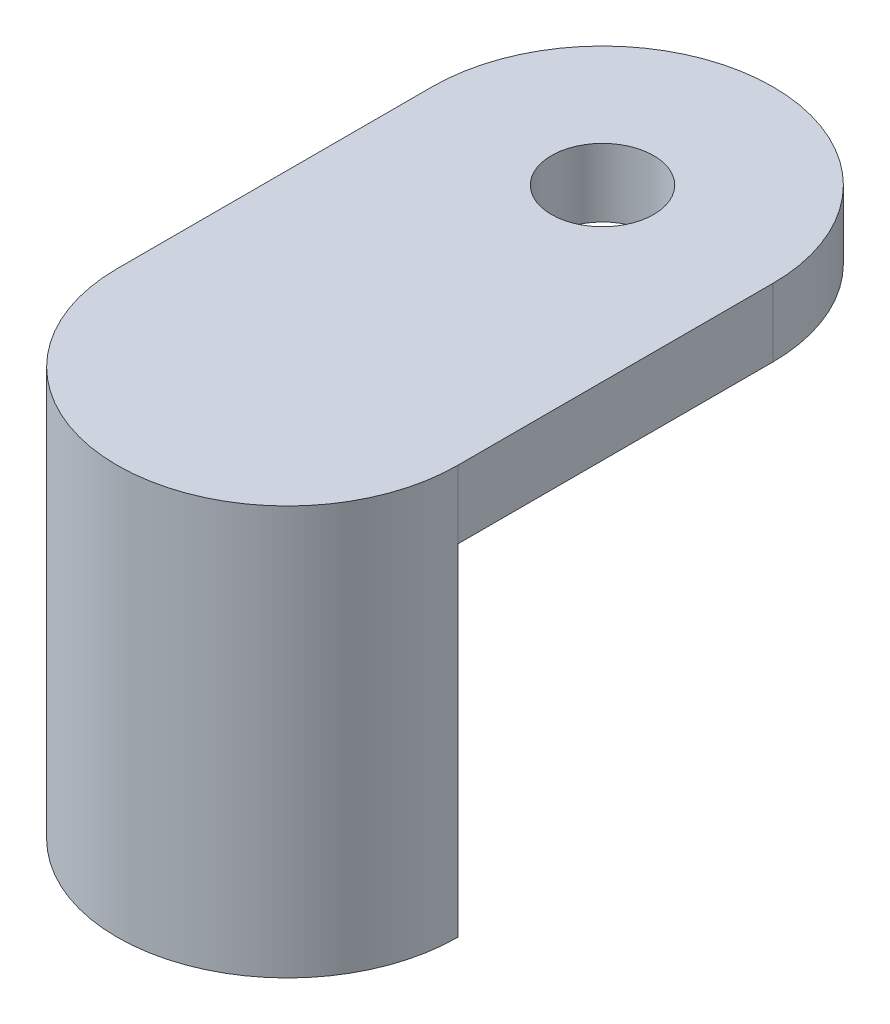
ISO-10303-21;
HEADER;
FILE_DESCRIPTION(('STEP AP214'),'2;1');
FILE_NAME('part.step','',(''),(''),'','','');
FILE_SCHEMA(('AUTOMOTIVE_DESIGN { 1 0 10303 214 1 1 1 1 }'));
ENDSEC;
DATA;
#1=APPLICATION_CONTEXT('core data for automotive mechanical design processes');
#2=APPLICATION_PROTOCOL_DEFINITION('international standard','automotive_design',2000,#1);
#3=PRODUCT_CONTEXT('',#1,'mechanical');
#4=PRODUCT('Part','Part','',(#3));
#5=PRODUCT_RELATED_PRODUCT_CATEGORY('part','',(#4));
#6=PRODUCT_DEFINITION_FORMATION('','',#4);
#7=PRODUCT_DEFINITION_CONTEXT('part definition',#1,'design');
#8=PRODUCT_DEFINITION('design','',#6,#7);
#9=PRODUCT_DEFINITION_SHAPE('','',#8);
#10=(LENGTH_UNIT() NAMED_UNIT(*) SI_UNIT(.MILLI.,.METRE.));
#11=(NAMED_UNIT(*) PLANE_ANGLE_UNIT() SI_UNIT($,.RADIAN.));
#12=(NAMED_UNIT(*) SI_UNIT($,.STERADIAN.) SOLID_ANGLE_UNIT());
#13=UNCERTAINTY_MEASURE_WITH_UNIT(LENGTH_MEASURE(1.E-05),#10,'distance_accuracy_value','');
#14=(GEOMETRIC_REPRESENTATION_CONTEXT(3) GLOBAL_UNCERTAINTY_ASSIGNED_CONTEXT((#13)) GLOBAL_UNIT_ASSIGNED_CONTEXT((#10,
#11,#12)) REPRESENTATION_CONTEXT('',''));
#15=CARTESIAN_POINT('',(0.,0.,0.));
#16=DIRECTION('',(0.,0.,1.));
#17=DIRECTION('',(1.,0.,0.));
#18=AXIS2_PLACEMENT_3D('',#15,#16,#17);
#19=CARTESIAN_POINT('',(0.,2.,0.));
#20=DIRECTION('',(0.,-1.,0.));
#21=DIRECTION('',(0.,0.,-1.));
#22=AXIS2_PLACEMENT_3D('',#19,#20,#21);
#23=CYLINDRICAL_SURFACE('',#22,5.);
#24=CARTESIAN_POINT('',(0.,0.,0.));
#25=DIRECTION('',(0.,1.,0.));
#26=DIRECTION('',(0.,0.,1.));
#27=AXIS2_PLACEMENT_3D('',#24,#25,#26);
#28=CIRCLE('',#27,5.);
#29=CARTESIAN_POINT('',(5.,0.,0.));
#30=VERTEX_POINT('',#29);
#31=CARTESIAN_POINT('',(-5.,0.,0.));
#32=VERTEX_POINT('',#31);
#33=EDGE_CURVE('E110',#30,#32,#28,.T.);
#34=ORIENTED_EDGE('',*,*,#33,.T.);
#35=DIRECTION('',(0.,-1.,0.));
#36=VECTOR('',#35,1.);
#37=CARTESIAN_POINT('',(-5.,2.,0.));
#38=LINE('',#37,#36);
#39=CARTESIAN_POINT('',(-5.,2.,0.));
#40=VERTEX_POINT('',#39);
#41=EDGE_CURVE('E43',#40,#32,#38,.T.);
#42=ORIENTED_EDGE('',*,*,#41,.F.);
#43=CARTESIAN_POINT('',(0.,2.,0.));
#44=DIRECTION('',(0.,1.,0.));
#45=DIRECTION('',(0.,0.,1.));
#46=AXIS2_PLACEMENT_3D('',#43,#44,#45);
#47=CIRCLE('',#46,5.);
#48=CARTESIAN_POINT('',(5.,2.,0.));
#49=VERTEX_POINT('',#48);
#50=EDGE_CURVE('E113',#49,#40,#47,.T.);
#51=ORIENTED_EDGE('',*,*,#50,.F.);
#52=DIRECTION('',(0.,-1.,0.));
#53=VECTOR('',#52,1.);
#54=CARTESIAN_POINT('',(5.,2.,0.));
#55=LINE('',#54,#53);
#56=EDGE_CURVE('E119',#49,#30,#55,.T.);
#57=ORIENTED_EDGE('',*,*,#56,.T.);
#58=EDGE_LOOP('',(#34,#42,#51,#57));
#59=FACE_BOUND('',#58,.T.);
#60=ADVANCED_FACE('F35',(#59),#23,.T.);
#61=CARTESIAN_POINT('',(-5.,2.,0.));
#62=DIRECTION('',(1.,0.,0.));
#63=DIRECTION('',(0.,0.,-1.));
#64=AXIS2_PLACEMENT_3D('',#61,#62,#63);
#65=PLANE('',#64);
#66=DIRECTION('',(0.,0.,1.));
#67=VECTOR('',#66,1.);
#68=CARTESIAN_POINT('',(-5.,0.,0.));
#69=LINE('',#68,#67);
#70=CARTESIAN_POINT('',(-5.,0.,9.25));
#71=VERTEX_POINT('',#70);
#72=EDGE_CURVE('E122',#32,#71,#69,.T.);
#73=ORIENTED_EDGE('',*,*,#72,.T.);
#74=DIRECTION('',(0.,-1.,0.));
#75=VECTOR('',#74,1.);
#76=CARTESIAN_POINT('',(-5.,2.,9.25));
#77=LINE('',#76,#75);
#78=CARTESIAN_POINT('',(-5.,2.,9.25));
#79=VERTEX_POINT('',#78);
#80=EDGE_CURVE('E129',#79,#71,#77,.T.);
#81=ORIENTED_EDGE('',*,*,#80,.F.);
#82=DIRECTION('',(0.,0.,1.));
#83=VECTOR('',#82,1.);
#84=CARTESIAN_POINT('',(-5.,2.,0.));
#85=LINE('',#84,#83);
#86=EDGE_CURVE('E80',#40,#79,#85,.T.);
#87=ORIENTED_EDGE('',*,*,#86,.F.);
#88=ORIENTED_EDGE('',*,*,#41,.T.);
#89=EDGE_LOOP('',(#73,#81,#87,#88));
#90=FACE_BOUND('',#89,.T.);
#91=ADVANCED_FACE('F131',(#90),#65,.F.);
#92=CARTESIAN_POINT('',(0.,2.,9.25));
#93=DIRECTION('',(0.,-1.,0.));
#94=DIRECTION('',(0.,0.,-1.));
#95=AXIS2_PLACEMENT_3D('',#92,#93,#94);
#96=CYLINDRICAL_SURFACE('',#95,5.);
#97=ORIENTED_EDGE('',*,*,#80,.T.);
#98=DIRECTION('',(0.,1.,0.));
#99=VECTOR('',#98,1.);
#100=CARTESIAN_POINT('',(-5.,-10.,9.25));
#101=LINE('',#100,#99);
#102=CARTESIAN_POINT('',(-5.,-10.,9.25));
#103=VERTEX_POINT('',#102);
#104=EDGE_CURVE('E66',#103,#71,#101,.T.);
#105=ORIENTED_EDGE('',*,*,#104,.F.);
#106=CARTESIAN_POINT('',(0.,-10.,9.25));
#107=DIRECTION('',(0.,1.,0.));
#108=DIRECTION('',(0.,0.,1.));
#109=AXIS2_PLACEMENT_3D('',#106,#107,#108);
#110=CIRCLE('',#109,5.);
#111=CARTESIAN_POINT('',(5.,-10.,9.25));
#112=VERTEX_POINT('',#111);
#113=EDGE_CURVE('E97',#103,#112,#110,.T.);
#114=ORIENTED_EDGE('',*,*,#113,.T.);
#115=DIRECTION('',(0.,1.,0.));
#116=VECTOR('',#115,1.);
#117=CARTESIAN_POINT('',(5.,-10.,9.25));
#118=LINE('',#117,#116);
#119=CARTESIAN_POINT('',(5.,0.,9.25));
#120=VERTEX_POINT('',#119);
#121=EDGE_CURVE('E88',#112,#120,#118,.T.);
#122=ORIENTED_EDGE('',*,*,#121,.T.);
#123=DIRECTION('',(0.,-1.,0.));
#124=VECTOR('',#123,1.);
#125=CARTESIAN_POINT('',(5.,2.,9.25));
#126=LINE('',#125,#124);
#127=CARTESIAN_POINT('',(5.,2.,9.25));
#128=VERTEX_POINT('',#127);
#129=EDGE_CURVE('E127',#128,#120,#126,.T.);
#130=ORIENTED_EDGE('',*,*,#129,.F.);
#131=CARTESIAN_POINT('',(0.,2.,9.25));
#132=DIRECTION('',(0.,1.,0.));
#133=DIRECTION('',(0.,0.,1.));
#134=AXIS2_PLACEMENT_3D('',#131,#132,#133);
#135=CIRCLE('',#134,5.);
#136=EDGE_CURVE('E116',#79,#128,#135,.T.);
#137=ORIENTED_EDGE('',*,*,#136,.F.);
#138=EDGE_LOOP('',(#97,#105,#114,#122,#130,#137));
#139=FACE_BOUND('',#138,.T.);
#140=ADVANCED_FACE('F99',(#139),#96,.T.);
#141=CARTESIAN_POINT('',(5.,2.,0.));
#142=DIRECTION('',(-1.,0.,0.));
#143=DIRECTION('',(0.,0.,1.));
#144=AXIS2_PLACEMENT_3D('',#141,#142,#143);
#145=PLANE('',#144);
#146=DIRECTION('',(0.,0.,-1.));
#147=VECTOR('',#146,1.);
#148=CARTESIAN_POINT('',(5.,0.,0.));
#149=LINE('',#148,#147);
#150=EDGE_CURVE('E72',#120,#30,#149,.T.);
#151=ORIENTED_EDGE('',*,*,#150,.T.);
#152=ORIENTED_EDGE('',*,*,#56,.F.);
#153=DIRECTION('',(0.,0.,-1.));
#154=VECTOR('',#153,1.);
#155=CARTESIAN_POINT('',(5.,2.,0.));
#156=LINE('',#155,#154);
#157=EDGE_CURVE('E51',#128,#49,#156,.T.);
#158=ORIENTED_EDGE('',*,*,#157,.F.);
#159=ORIENTED_EDGE('',*,*,#129,.T.);
#160=EDGE_LOOP('',(#151,#152,#158,#159));
#161=FACE_BOUND('',#160,.T.);
#162=ADVANCED_FACE('F148',(#161),#145,.F.);
#163=CARTESIAN_POINT('',(0.,2.,0.));
#164=DIRECTION('',(0.,1.,0.));
#165=DIRECTION('',(0.,0.,1.));
#166=AXIS2_PLACEMENT_3D('',#163,#164,#165);
#167=PLANE('',#166);
#168=ORIENTED_EDGE('',*,*,#86,.T.);
#169=ORIENTED_EDGE('',*,*,#136,.T.);
#170=ORIENTED_EDGE('',*,*,#157,.T.);
#171=ORIENTED_EDGE('',*,*,#50,.T.);
#172=EDGE_LOOP('',(#168,#169,#170,#171));
#173=FACE_BOUND('',#172,.T.);
#174=CARTESIAN_POINT('',(0.,2.,0.));
#175=DIRECTION('',(0.,1.,0.));
#176=DIRECTION('',(0.,0.,1.));
#177=AXIS2_PLACEMENT_3D('',#174,#175,#176);
#178=CIRCLE('',#177,1.5);
#179=CARTESIAN_POINT('',(0.,2.,1.5));
#180=VERTEX_POINT('',#179);
#181=EDGE_CURVE('E105',#180,#180,#178,.T.);
#182=ORIENTED_EDGE('',*,*,#181,.F.);
#183=EDGE_LOOP('',(#182));
#184=FACE_BOUND('',#183,.T.);
#185=ADVANCED_FACE('F139',(#173,#184),#167,.T.);
#186=CARTESIAN_POINT('',(0.,0.,0.));
#187=DIRECTION('',(0.,1.,0.));
#188=DIRECTION('',(0.,0.,1.));
#189=AXIS2_PLACEMENT_3D('',#186,#187,#188);
#190=PLANE('',#189);
#191=CARTESIAN_POINT('',(0.,0.,0.));
#192=DIRECTION('',(0.,1.,0.));
#193=DIRECTION('',(0.,0.,1.));
#194=AXIS2_PLACEMENT_3D('',#191,#192,#193);
#195=CIRCLE('',#194,1.5);
#196=CARTESIAN_POINT('',(0.,0.,1.5));
#197=VERTEX_POINT('',#196);
#198=EDGE_CURVE('E107',#197,#197,#195,.T.);
#199=ORIENTED_EDGE('',*,*,#198,.T.);
#200=EDGE_LOOP('',(#199));
#201=FACE_BOUND('',#200,.T.);
#202=ORIENTED_EDGE('',*,*,#150,.F.);
#203=DIRECTION('',(-1.,0.,0.));
#204=VECTOR('',#203,1.);
#205=CARTESIAN_POINT('',(0.,0.,9.25));
#206=LINE('',#205,#204);
#207=EDGE_CURVE('E11',#120,#71,#206,.T.);
#208=ORIENTED_EDGE('',*,*,#207,.T.);
#209=ORIENTED_EDGE('',*,*,#72,.F.);
#210=ORIENTED_EDGE('',*,*,#33,.F.);
#211=EDGE_LOOP('',(#202,#208,#209,#210));
#212=FACE_BOUND('',#211,.T.);
#213=ADVANCED_FACE('F136',(#201,#212),#190,.F.);
#214=CARTESIAN_POINT('',(0.,0.,0.));
#215=DIRECTION('',(0.,1.,0.));
#216=DIRECTION('',(0.,0.,1.));
#217=AXIS2_PLACEMENT_3D('',#214,#215,#216);
#218=CYLINDRICAL_SURFACE('',#217,1.5);
#219=ORIENTED_EDGE('',*,*,#198,.F.);
#220=EDGE_LOOP('',(#219));
#221=FACE_BOUND('',#220,.T.);
#222=ORIENTED_EDGE('',*,*,#181,.T.);
#223=EDGE_LOOP('',(#222));
#224=FACE_BOUND('',#223,.T.);
#225=ADVANCED_FACE('F138',(#221,#224),#218,.F.);
#226=CARTESIAN_POINT('',(-5.,-10.,9.25));
#227=DIRECTION('',(0.,0.,-1.));
#228=DIRECTION('',(-1.,0.,0.));
#229=AXIS2_PLACEMENT_3D('',#226,#227,#228);
#230=PLANE('',#229);
#231=ORIENTED_EDGE('',*,*,#207,.F.);
#232=ORIENTED_EDGE('',*,*,#121,.F.);
#233=DIRECTION('',(-1.,0.,0.));
#234=VECTOR('',#233,1.);
#235=CARTESIAN_POINT('',(-5.,-10.,9.25));
#236=LINE('',#235,#234);
#237=EDGE_CURVE('E92',#112,#103,#236,.T.);
#238=ORIENTED_EDGE('',*,*,#237,.T.);
#239=ORIENTED_EDGE('',*,*,#104,.T.);
#240=EDGE_LOOP('',(#231,#232,#238,#239));
#241=FACE_BOUND('',#240,.T.);
#242=ADVANCED_FACE('F90',(#241),#230,.T.);
#243=CARTESIAN_POINT('',(0.,-10.,9.25));
#244=DIRECTION('',(0.,1.,0.));
#245=DIRECTION('',(0.,0.,1.));
#246=AXIS2_PLACEMENT_3D('',#243,#244,#245);
#247=PLANE('',#246);
#248=ORIENTED_EDGE('',*,*,#113,.F.);
#249=ORIENTED_EDGE('',*,*,#237,.F.);
#250=EDGE_LOOP('',(#248,#249));
#251=FACE_BOUND('',#250,.T.);
#252=ADVANCED_FACE('F102',(#251),#247,.F.);
#253=CLOSED_SHELL('',(#60,#91,#140,#162,#185,#213,#225,#242,#252));
#254=MANIFOLD_SOLID_BREP('B2',#253);
#255=ADVANCED_BREP_SHAPE_REPRESENTATION('',(#18,#254),#14);
#256=SHAPE_DEFINITION_REPRESENTATION(#9,#255);
ENDSEC;
END-ISO-10303-21;
